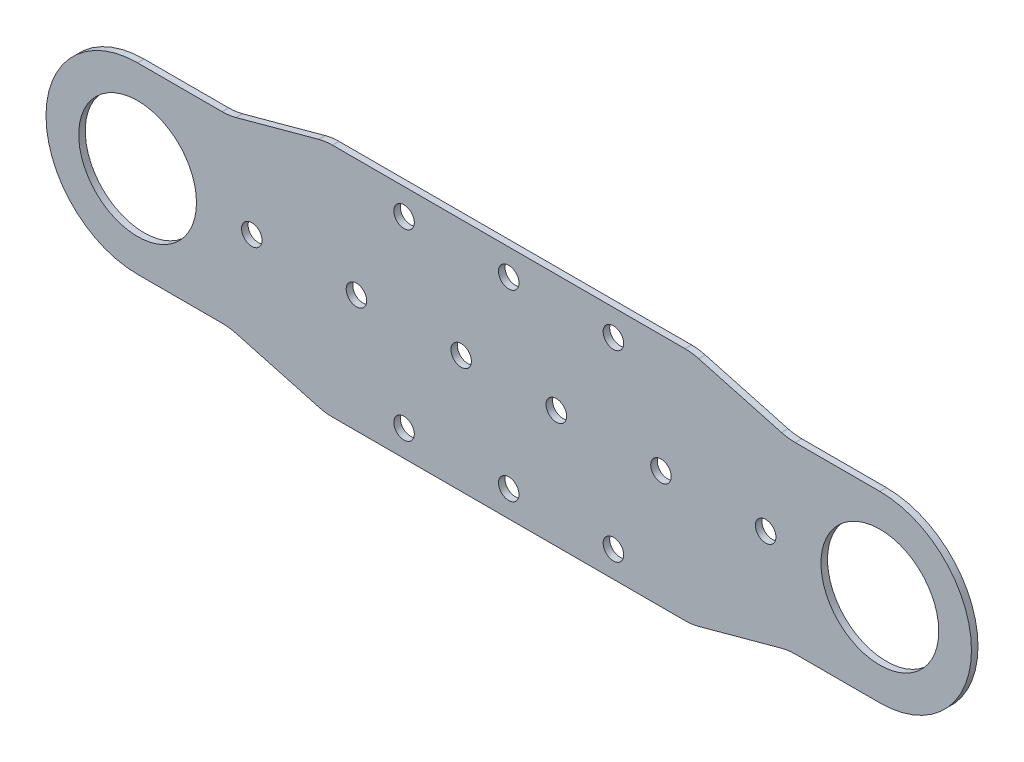
ISO-10303-21;
HEADER;
FILE_DESCRIPTION(('STEP AP214'),'2;1');
FILE_NAME('part.step','',(''),(''),'','','');
FILE_SCHEMA(('AUTOMOTIVE_DESIGN { 1 0 10303 214 1 1 1 1 }'));
ENDSEC;
DATA;
#1=APPLICATION_CONTEXT('core data for automotive mechanical design processes');
#2=APPLICATION_PROTOCOL_DEFINITION('international standard','automotive_design',2000,#1);
#3=PRODUCT_CONTEXT('',#1,'mechanical');
#4=PRODUCT('Part','Part','',(#3));
#5=PRODUCT_RELATED_PRODUCT_CATEGORY('part','',(#4));
#6=PRODUCT_DEFINITION_FORMATION('','',#4);
#7=PRODUCT_DEFINITION_CONTEXT('part definition',#1,'design');
#8=PRODUCT_DEFINITION('design','',#6,#7);
#9=PRODUCT_DEFINITION_SHAPE('','',#8);
#10=(LENGTH_UNIT() NAMED_UNIT(*) SI_UNIT(.MILLI.,.METRE.));
#11=(NAMED_UNIT(*) PLANE_ANGLE_UNIT() SI_UNIT($,.RADIAN.));
#12=(NAMED_UNIT(*) SI_UNIT($,.STERADIAN.) SOLID_ANGLE_UNIT());
#13=UNCERTAINTY_MEASURE_WITH_UNIT(LENGTH_MEASURE(1.E-05),#10,'distance_accuracy_value','');
#14=(GEOMETRIC_REPRESENTATION_CONTEXT(3) GLOBAL_UNCERTAINTY_ASSIGNED_CONTEXT((#13)) GLOBAL_UNIT_ASSIGNED_CONTEXT((#10,
#11,#12)) REPRESENTATION_CONTEXT('',''));
#15=CARTESIAN_POINT('',(0.,0.,0.));
#16=DIRECTION('',(0.,0.,1.));
#17=DIRECTION('',(1.,0.,0.));
#18=AXIS2_PLACEMENT_3D('',#15,#16,#17);
#19=CARTESIAN_POINT('',(0.,0.,1.5875));
#20=DIRECTION('',(0.,0.,1.));
#21=DIRECTION('',(1.,0.,0.));
#22=AXIS2_PLACEMENT_3D('',#19,#20,#21);
#23=PLANE('',#22);
#24=CARTESIAN_POINT('',(27.7114,0.,1.5875));
#25=DIRECTION('',(0.,0.,1.));
#26=DIRECTION('',(1.,0.,0.));
#27=AXIS2_PLACEMENT_3D('',#24,#25,#26);
#28=CIRCLE('',#27,2.48919999999999);
#29=CARTESIAN_POINT('',(30.2006,0.,1.5875));
#30=VERTEX_POINT('',#29);
#31=EDGE_CURVE('E456',#30,#30,#28,.T.);
#32=ORIENTED_EDGE('',*,*,#31,.F.);
#33=EDGE_LOOP('',(#32));
#34=FACE_BOUND('',#33,.T.);
#35=CARTESIAN_POINT('',(64.6557,22.225,1.5875));
#36=DIRECTION('',(0.,0.,1.));
#37=DIRECTION('',(1.,0.,0.));
#38=AXIS2_PLACEMENT_3D('',#35,#36,#37);
#39=CIRCLE('',#38,2.4892);
#40=CARTESIAN_POINT('',(67.1449,22.225,1.5875));
#41=VERTEX_POINT('',#40);
#42=EDGE_CURVE('E458',#41,#41,#39,.T.);
#43=ORIENTED_EDGE('',*,*,#42,.F.);
#44=EDGE_LOOP('',(#43));
#45=FACE_BOUND('',#44,.T.);
#46=CARTESIAN_POINT('',(90.0557,22.225,1.5875));
#47=DIRECTION('',(0.,0.,1.));
#48=DIRECTION('',(1.,0.,0.));
#49=AXIS2_PLACEMENT_3D('',#46,#47,#48);
#50=CIRCLE('',#49,2.4892);
#51=CARTESIAN_POINT('',(92.5449,22.225,1.5875));
#52=VERTEX_POINT('',#51);
#53=EDGE_CURVE('E466',#52,#52,#50,.T.);
#54=ORIENTED_EDGE('',*,*,#53,.F.);
#55=EDGE_LOOP('',(#54));
#56=FACE_BOUND('',#55,.T.);
#57=CARTESIAN_POINT('',(53.1114,0.,1.5875));
#58=DIRECTION('',(0.,0.,1.));
#59=DIRECTION('',(1.,0.,0.));
#60=AXIS2_PLACEMENT_3D('',#57,#58,#59);
#61=CIRCLE('',#60,2.48919999999999);
#62=CARTESIAN_POINT('',(55.6006,0.,1.5875));
#63=VERTEX_POINT('',#62);
#64=EDGE_CURVE('E472',#63,#63,#61,.T.);
#65=ORIENTED_EDGE('',*,*,#64,.F.);
#66=EDGE_LOOP('',(#65));
#67=FACE_BOUND('',#66,.T.);
#68=CARTESIAN_POINT('',(78.5114,0.,1.5875));
#69=DIRECTION('',(0.,0.,1.));
#70=DIRECTION('',(1.,0.,0.));
#71=AXIS2_PLACEMENT_3D('',#68,#69,#70);
#72=CIRCLE('',#71,2.4892);
#73=CARTESIAN_POINT('',(81.0006,0.,1.5875));
#74=VERTEX_POINT('',#73);
#75=EDGE_CURVE('E478',#74,#74,#72,.T.);
#76=ORIENTED_EDGE('',*,*,#75,.F.);
#77=EDGE_LOOP('',(#76));
#78=FACE_BOUND('',#77,.T.);
#79=CARTESIAN_POINT('',(101.6,0.,1.5875));
#80=DIRECTION('',(0.,0.,1.));
#81=DIRECTION('',(1.,0.,0.));
#82=AXIS2_PLACEMENT_3D('',#79,#80,#81);
#83=CIRCLE('',#82,2.4892);
#84=CARTESIAN_POINT('',(104.0892,0.,1.5875));
#85=VERTEX_POINT('',#84);
#86=EDGE_CURVE('E484',#85,#85,#83,.T.);
#87=ORIENTED_EDGE('',*,*,#86,.F.);
#88=EDGE_LOOP('',(#87));
#89=FACE_BOUND('',#88,.T.);
#90=CARTESIAN_POINT('',(127.,0.,1.5875));
#91=DIRECTION('',(0.,0.,1.));
#92=DIRECTION('',(1.,0.,0.));
#93=AXIS2_PLACEMENT_3D('',#90,#91,#92);
#94=CIRCLE('',#93,2.4892);
#95=CARTESIAN_POINT('',(129.4892,0.,1.5875));
#96=VERTEX_POINT('',#95);
#97=EDGE_CURVE('E490',#96,#96,#94,.T.);
#98=ORIENTED_EDGE('',*,*,#97,.F.);
#99=EDGE_LOOP('',(#98));
#100=FACE_BOUND('',#99,.T.);
#101=CARTESIAN_POINT('',(115.4557,22.225,1.5875));
#102=DIRECTION('',(0.,0.,1.));
#103=DIRECTION('',(1.,0.,0.));
#104=AXIS2_PLACEMENT_3D('',#101,#102,#103);
#105=CIRCLE('',#104,2.4892);
#106=CARTESIAN_POINT('',(117.9449,22.225,1.5875));
#107=VERTEX_POINT('',#106);
#108=EDGE_CURVE('E496',#107,#107,#105,.T.);
#109=ORIENTED_EDGE('',*,*,#108,.F.);
#110=EDGE_LOOP('',(#109));
#111=FACE_BOUND('',#110,.T.);
#112=CARTESIAN_POINT('',(152.4,0.,1.5875));
#113=DIRECTION('',(0.,0.,1.));
#114=DIRECTION('',(1.,0.,0.));
#115=AXIS2_PLACEMENT_3D('',#112,#113,#114);
#116=CIRCLE('',#115,2.4892);
#117=CARTESIAN_POINT('',(154.8892,0.,1.5875));
#118=VERTEX_POINT('',#117);
#119=EDGE_CURVE('E502',#118,#118,#116,.T.);
#120=ORIENTED_EDGE('',*,*,#119,.F.);
#121=EDGE_LOOP('',(#120));
#122=FACE_BOUND('',#121,.T.);
#123=CARTESIAN_POINT('',(115.4557,-22.225,1.5875));
#124=DIRECTION('',(0.,0.,1.));
#125=DIRECTION('',(1.,0.,0.));
#126=AXIS2_PLACEMENT_3D('',#123,#124,#125);
#127=CIRCLE('',#126,2.4892);
#128=CARTESIAN_POINT('',(117.9449,-22.225,1.5875));
#129=VERTEX_POINT('',#128);
#130=EDGE_CURVE('E508',#129,#129,#127,.T.);
#131=ORIENTED_EDGE('',*,*,#130,.F.);
#132=EDGE_LOOP('',(#131));
#133=FACE_BOUND('',#132,.T.);
#134=CARTESIAN_POINT('',(90.0556999999999,-22.225,1.5875));
#135=DIRECTION('',(0.,0.,1.));
#136=DIRECTION('',(1.,0.,0.));
#137=AXIS2_PLACEMENT_3D('',#134,#135,#136);
#138=CIRCLE('',#137,2.4892);
#139=CARTESIAN_POINT('',(92.5448999999999,-22.225,1.5875));
#140=VERTEX_POINT('',#139);
#141=EDGE_CURVE('E514',#140,#140,#138,.T.);
#142=ORIENTED_EDGE('',*,*,#141,.F.);
#143=EDGE_LOOP('',(#142));
#144=FACE_BOUND('',#143,.T.);
#145=CARTESIAN_POINT('',(64.6556999999999,-22.225,1.5875));
#146=DIRECTION('',(0.,0.,1.));
#147=DIRECTION('',(1.,0.,0.));
#148=AXIS2_PLACEMENT_3D('',#145,#146,#147);
#149=CIRCLE('',#148,2.4892);
#150=CARTESIAN_POINT('',(67.1448999999999,-22.225,1.5875));
#151=VERTEX_POINT('',#150);
#152=EDGE_CURVE('E520',#151,#151,#149,.T.);
#153=ORIENTED_EDGE('',*,*,#152,.F.);
#154=EDGE_LOOP('',(#153));
#155=FACE_BOUND('',#154,.T.);
#156=CARTESIAN_POINT('',(0.,0.,1.5875));
#157=DIRECTION('',(0.,0.,1.));
#158=DIRECTION('',(1.,0.,0.));
#159=AXIS2_PLACEMENT_3D('',#156,#157,#158);
#160=CIRCLE('',#159,14.2875);
#161=CARTESIAN_POINT('',(14.2875,0.,1.5875));
#162=VERTEX_POINT('',#161);
#163=EDGE_CURVE('E310',#162,#162,#160,.T.);
#164=ORIENTED_EDGE('',*,*,#163,.F.);
#165=EDGE_LOOP('',(#164));
#166=FACE_BOUND('',#165,.T.);
#167=DIRECTION('',(-0.965041508014612,0.262097096147369,0.));
#168=VECTOR('',#167,1.);
#169=CARTESIAN_POINT('',(134.5057,28.575,1.5875));
#170=LINE('',#169,#168);
#171=CARTESIAN_POINT('',(156.251691972874,22.6689728482144,1.5875));
#172=VERTEX_POINT('',#171);
#173=CARTESIAN_POINT('',(136.140408027125,28.1310271517856,1.5875));
#174=VERTEX_POINT('',#173);
#175=EDGE_CURVE('E300',#172,#174,#170,.T.);
#176=ORIENTED_EDGE('',*,*,#175,.T.);
#177=CARTESIAN_POINT('',(132.811774906054,15.875,1.5875));
#178=DIRECTION('',(0.,0.,1.));
#179=DIRECTION('',(1.,0.,0.));
#180=AXIS2_PLACEMENT_3D('',#177,#178,#179);
#181=CIRCLE('',#180,12.7);
#182=CARTESIAN_POINT('',(132.811774906054,28.575,1.5875));
#183=VERTEX_POINT('',#182);
#184=EDGE_CURVE('E237',#174,#183,#181,.T.);
#185=ORIENTED_EDGE('',*,*,#184,.T.);
#186=DIRECTION('',(-1.,0.,0.));
#187=VECTOR('',#186,1.);
#188=CARTESIAN_POINT('',(45.6057,28.575,1.5875));
#189=LINE('',#188,#187);
#190=CARTESIAN_POINT('',(47.2996250939461,28.575,1.5875));
#191=VERTEX_POINT('',#190);
#192=EDGE_CURVE('E302',#183,#191,#189,.T.);
#193=ORIENTED_EDGE('',*,*,#192,.T.);
#194=CARTESIAN_POINT('',(47.2996250939461,15.875,1.5875));
#195=DIRECTION('',(0.,0.,1.));
#196=DIRECTION('',(1.,0.,0.));
#197=AXIS2_PLACEMENT_3D('',#194,#195,#196);
#198=CIRCLE('',#197,12.7);
#199=CARTESIAN_POINT('',(43.9709919728745,28.1310271517856,1.5875));
#200=VERTEX_POINT('',#199);
#201=EDGE_CURVE('E231',#191,#200,#198,.T.);
#202=ORIENTED_EDGE('',*,*,#201,.T.);
#203=DIRECTION('',(-0.965041508014612,-0.262097096147369,0.));
#204=VECTOR('',#203,1.);
#205=CARTESIAN_POINT('',(22.225,22.225,1.5875));
#206=LINE('',#205,#204);
#207=CARTESIAN_POINT('',(23.8597080271255,22.6689728482144,1.5875));
#208=VERTEX_POINT('',#207);
#209=EDGE_CURVE('E305',#200,#208,#206,.T.);
#210=ORIENTED_EDGE('',*,*,#209,.T.);
#211=CARTESIAN_POINT('',(20.5310749060539,34.925,1.5875));
#212=DIRECTION('',(0.,0.,1.));
#213=DIRECTION('',(1.,0.,0.));
#214=AXIS2_PLACEMENT_3D('',#211,#212,#213);
#215=CIRCLE('',#214,12.7);
#216=CARTESIAN_POINT('',(20.5310749060539,22.225,1.5875));
#217=VERTEX_POINT('',#216);
#218=EDGE_CURVE('E261',#208,#217,#215,.F.);
#219=ORIENTED_EDGE('',*,*,#218,.T.);
#220=DIRECTION('',(-1.,0.,0.));
#221=VECTOR('',#220,1.);
#222=CARTESIAN_POINT('',(0.,22.225,1.5875));
#223=LINE('',#222,#221);
#224=CARTESIAN_POINT('',(0.,22.225,1.5875));
#225=VERTEX_POINT('',#224);
#226=EDGE_CURVE('E189',#217,#225,#223,.T.);
#227=ORIENTED_EDGE('',*,*,#226,.T.);
#228=CARTESIAN_POINT('',(0.,0.,1.5875));
#229=DIRECTION('',(0.,0.,1.));
#230=DIRECTION('',(1.,0.,0.));
#231=AXIS2_PLACEMENT_3D('',#228,#229,#230);
#232=CIRCLE('',#231,22.225);
#233=CARTESIAN_POINT('',(0.,-22.225,1.5875));
#234=VERTEX_POINT('',#233);
#235=EDGE_CURVE('E183',#225,#234,#232,.T.);
#236=ORIENTED_EDGE('',*,*,#235,.T.);
#237=DIRECTION('',(1.,0.,0.));
#238=VECTOR('',#237,1.);
#239=CARTESIAN_POINT('',(0.,-22.225,1.5875));
#240=LINE('',#239,#238);
#241=CARTESIAN_POINT('',(20.5310749060539,-22.225,1.5875));
#242=VERTEX_POINT('',#241);
#243=EDGE_CURVE('E172',#234,#242,#240,.T.);
#244=ORIENTED_EDGE('',*,*,#243,.T.);
#245=CARTESIAN_POINT('',(20.5310749060539,-34.925,1.5875));
#246=DIRECTION('',(0.,0.,1.));
#247=DIRECTION('',(1.,0.,0.));
#248=AXIS2_PLACEMENT_3D('',#245,#246,#247);
#249=CIRCLE('',#248,12.7);
#250=CARTESIAN_POINT('',(23.8597080271255,-22.6689728482144,1.5875));
#251=VERTEX_POINT('',#250);
#252=EDGE_CURVE('E11',#242,#251,#249,.F.);
#253=ORIENTED_EDGE('',*,*,#252,.T.);
#254=DIRECTION('',(0.965041508014612,-0.262097096147369,0.));
#255=VECTOR('',#254,1.);
#256=CARTESIAN_POINT('',(22.225,-22.225,1.5875));
#257=LINE('',#256,#255);
#258=CARTESIAN_POINT('',(43.9709919728745,-28.1310271517856,1.5875));
#259=VERTEX_POINT('',#258);
#260=EDGE_CURVE('E182',#251,#259,#257,.T.);
#261=ORIENTED_EDGE('',*,*,#260,.T.);
#262=CARTESIAN_POINT('',(47.2996250939461,-15.875,1.5875));
#263=DIRECTION('',(0.,0.,1.));
#264=DIRECTION('',(1.,0.,0.));
#265=AXIS2_PLACEMENT_3D('',#262,#263,#264);
#266=CIRCLE('',#265,12.7);
#267=CARTESIAN_POINT('',(47.2996250939461,-28.575,1.5875));
#268=VERTEX_POINT('',#267);
#269=EDGE_CURVE('E233',#259,#268,#266,.T.);
#270=ORIENTED_EDGE('',*,*,#269,.T.);
#271=DIRECTION('',(1.,0.,0.));
#272=VECTOR('',#271,1.);
#273=CARTESIAN_POINT('',(45.6057,-28.575,1.5875));
#274=LINE('',#273,#272);
#275=CARTESIAN_POINT('',(132.811774906054,-28.575,1.5875));
#276=VERTEX_POINT('',#275);
#277=EDGE_CURVE('E287',#268,#276,#274,.T.);
#278=ORIENTED_EDGE('',*,*,#277,.T.);
#279=CARTESIAN_POINT('',(132.811774906054,-15.875,1.5875));
#280=DIRECTION('',(0.,0.,1.));
#281=DIRECTION('',(1.,0.,0.));
#282=AXIS2_PLACEMENT_3D('',#279,#280,#281);
#283=CIRCLE('',#282,12.7);
#284=CARTESIAN_POINT('',(136.140408027125,-28.1310271517856,1.5875));
#285=VERTEX_POINT('',#284);
#286=EDGE_CURVE('E235',#276,#285,#283,.T.);
#287=ORIENTED_EDGE('',*,*,#286,.T.);
#288=DIRECTION('',(0.965041508014612,0.262097096147369,0.));
#289=VECTOR('',#288,1.);
#290=CARTESIAN_POINT('',(134.5057,-28.575,1.5875));
#291=LINE('',#290,#289);
#292=CARTESIAN_POINT('',(156.251691972874,-22.6689728482144,1.5875));
#293=VERTEX_POINT('',#292);
#294=EDGE_CURVE('E290',#285,#293,#291,.T.);
#295=ORIENTED_EDGE('',*,*,#294,.T.);
#296=CARTESIAN_POINT('',(159.580325093946,-34.925,1.5875));
#297=DIRECTION('',(0.,0.,1.));
#298=DIRECTION('',(1.,0.,0.));
#299=AXIS2_PLACEMENT_3D('',#296,#297,#298);
#300=CIRCLE('',#299,12.7);
#301=CARTESIAN_POINT('',(159.580325093946,-22.225,1.5875));
#302=VERTEX_POINT('',#301);
#303=EDGE_CURVE('E56',#293,#302,#300,.F.);
#304=ORIENTED_EDGE('',*,*,#303,.T.);
#305=DIRECTION('',(1.,0.,0.));
#306=VECTOR('',#305,1.);
#307=CARTESIAN_POINT('',(157.8864,-22.225,1.5875));
#308=LINE('',#307,#306);
#309=CARTESIAN_POINT('',(180.1114,-22.225,1.5875));
#310=VERTEX_POINT('',#309);
#311=EDGE_CURVE('E294',#302,#310,#308,.T.);
#312=ORIENTED_EDGE('',*,*,#311,.T.);
#313=CARTESIAN_POINT('',(180.1114,0.,1.5875));
#314=DIRECTION('',(0.,0.,1.));
#315=DIRECTION('',(-1.,0.,0.));
#316=AXIS2_PLACEMENT_3D('',#313,#314,#315);
#317=CIRCLE('',#316,22.225);
#318=CARTESIAN_POINT('',(180.1114,22.225,1.5875));
#319=VERTEX_POINT('',#318);
#320=EDGE_CURVE('E296',#310,#319,#317,.T.);
#321=ORIENTED_EDGE('',*,*,#320,.T.);
#322=DIRECTION('',(-1.,0.,0.));
#323=VECTOR('',#322,1.);
#324=CARTESIAN_POINT('',(157.8864,22.225,1.5875));
#325=LINE('',#324,#323);
#326=CARTESIAN_POINT('',(159.580325093946,22.225,1.5875));
#327=VERTEX_POINT('',#326);
#328=EDGE_CURVE('E298',#319,#327,#325,.T.);
#329=ORIENTED_EDGE('',*,*,#328,.T.);
#330=CARTESIAN_POINT('',(159.580325093946,34.925,1.5875));
#331=DIRECTION('',(0.,0.,1.));
#332=DIRECTION('',(1.,0.,0.));
#333=AXIS2_PLACEMENT_3D('',#330,#331,#332);
#334=CIRCLE('',#333,12.7);
#335=EDGE_CURVE('E265',#327,#172,#334,.F.);
#336=ORIENTED_EDGE('',*,*,#335,.T.);
#337=EDGE_LOOP('',(#176,#185,#193,#202,#210,#219,#227,#236,#244,#253,#261,#270,#278,#287,#295,
#304,#312,#321,#329,#336));
#338=FACE_BOUND('',#337,.T.);
#339=CARTESIAN_POINT('',(180.1114,0.,1.5875));
#340=DIRECTION('',(0.,0.,1.));
#341=DIRECTION('',(1.,0.,0.));
#342=AXIS2_PLACEMENT_3D('',#339,#340,#341);
#343=CIRCLE('',#342,14.2875);
#344=CARTESIAN_POINT('',(194.3989,0.,1.5875));
#345=VERTEX_POINT('',#344);
#346=EDGE_CURVE('E527',#345,#345,#343,.T.);
#347=ORIENTED_EDGE('',*,*,#346,.F.);
#348=EDGE_LOOP('',(#347));
#349=FACE_BOUND('',#348,.T.);
#350=ADVANCED_FACE('F33',(#34,#45,#56,#67,#78,#89,#100,#111,#122,#133,#144,#155,#166,#338,#349),
#23,.T.);
#351=CARTESIAN_POINT('',(0.,0.,0.));
#352=DIRECTION('',(0.,0.,1.));
#353=DIRECTION('',(1.,0.,0.));
#354=AXIS2_PLACEMENT_3D('',#351,#352,#353);
#355=PLANE('',#354);
#356=CARTESIAN_POINT('',(27.7114,0.,0.));
#357=DIRECTION('',(0.,0.,1.));
#358=DIRECTION('',(1.,0.,0.));
#359=AXIS2_PLACEMENT_3D('',#356,#357,#358);
#360=CIRCLE('',#359,2.48919999999999);
#361=CARTESIAN_POINT('',(30.2006,0.,0.));
#362=VERTEX_POINT('',#361);
#363=EDGE_CURVE('E454',#362,#362,#360,.T.);
#364=ORIENTED_EDGE('',*,*,#363,.T.);
#365=EDGE_LOOP('',(#364));
#366=FACE_BOUND('',#365,.T.);
#367=CARTESIAN_POINT('',(64.6557,22.225,0.));
#368=DIRECTION('',(0.,0.,1.));
#369=DIRECTION('',(1.,0.,0.));
#370=AXIS2_PLACEMENT_3D('',#367,#368,#369);
#371=CIRCLE('',#370,2.4892);
#372=CARTESIAN_POINT('',(67.1449,22.225,0.));
#373=VERTEX_POINT('',#372);
#374=EDGE_CURVE('E463',#373,#373,#371,.T.);
#375=ORIENTED_EDGE('',*,*,#374,.T.);
#376=EDGE_LOOP('',(#375));
#377=FACE_BOUND('',#376,.T.);
#378=CARTESIAN_POINT('',(90.0557,22.225,0.));
#379=DIRECTION('',(0.,0.,1.));
#380=DIRECTION('',(1.,0.,0.));
#381=AXIS2_PLACEMENT_3D('',#378,#379,#380);
#382=CIRCLE('',#381,2.4892);
#383=CARTESIAN_POINT('',(92.5449,22.225,0.));
#384=VERTEX_POINT('',#383);
#385=EDGE_CURVE('E469',#384,#384,#382,.T.);
#386=ORIENTED_EDGE('',*,*,#385,.T.);
#387=EDGE_LOOP('',(#386));
#388=FACE_BOUND('',#387,.T.);
#389=CARTESIAN_POINT('',(53.1114,0.,0.));
#390=DIRECTION('',(0.,0.,1.));
#391=DIRECTION('',(1.,0.,0.));
#392=AXIS2_PLACEMENT_3D('',#389,#390,#391);
#393=CIRCLE('',#392,2.48919999999999);
#394=CARTESIAN_POINT('',(55.6006,0.,0.));
#395=VERTEX_POINT('',#394);
#396=EDGE_CURVE('E475',#395,#395,#393,.T.);
#397=ORIENTED_EDGE('',*,*,#396,.T.);
#398=EDGE_LOOP('',(#397));
#399=FACE_BOUND('',#398,.T.);
#400=CARTESIAN_POINT('',(78.5114,0.,0.));
#401=DIRECTION('',(0.,0.,1.));
#402=DIRECTION('',(1.,0.,0.));
#403=AXIS2_PLACEMENT_3D('',#400,#401,#402);
#404=CIRCLE('',#403,2.4892);
#405=CARTESIAN_POINT('',(81.0006,0.,0.));
#406=VERTEX_POINT('',#405);
#407=EDGE_CURVE('E481',#406,#406,#404,.T.);
#408=ORIENTED_EDGE('',*,*,#407,.T.);
#409=EDGE_LOOP('',(#408));
#410=FACE_BOUND('',#409,.T.);
#411=CARTESIAN_POINT('',(101.6,0.,0.));
#412=DIRECTION('',(0.,0.,1.));
#413=DIRECTION('',(1.,0.,0.));
#414=AXIS2_PLACEMENT_3D('',#411,#412,#413);
#415=CIRCLE('',#414,2.4892);
#416=CARTESIAN_POINT('',(104.0892,0.,0.));
#417=VERTEX_POINT('',#416);
#418=EDGE_CURVE('E487',#417,#417,#415,.T.);
#419=ORIENTED_EDGE('',*,*,#418,.T.);
#420=EDGE_LOOP('',(#419));
#421=FACE_BOUND('',#420,.T.);
#422=CARTESIAN_POINT('',(127.,0.,0.));
#423=DIRECTION('',(0.,0.,1.));
#424=DIRECTION('',(1.,0.,0.));
#425=AXIS2_PLACEMENT_3D('',#422,#423,#424);
#426=CIRCLE('',#425,2.4892);
#427=CARTESIAN_POINT('',(129.4892,0.,0.));
#428=VERTEX_POINT('',#427);
#429=EDGE_CURVE('E493',#428,#428,#426,.T.);
#430=ORIENTED_EDGE('',*,*,#429,.T.);
#431=EDGE_LOOP('',(#430));
#432=FACE_BOUND('',#431,.T.);
#433=CARTESIAN_POINT('',(115.4557,22.225,0.));
#434=DIRECTION('',(0.,0.,1.));
#435=DIRECTION('',(1.,0.,0.));
#436=AXIS2_PLACEMENT_3D('',#433,#434,#435);
#437=CIRCLE('',#436,2.4892);
#438=CARTESIAN_POINT('',(117.9449,22.225,0.));
#439=VERTEX_POINT('',#438);
#440=EDGE_CURVE('E499',#439,#439,#437,.T.);
#441=ORIENTED_EDGE('',*,*,#440,.T.);
#442=EDGE_LOOP('',(#441));
#443=FACE_BOUND('',#442,.T.);
#444=CARTESIAN_POINT('',(152.4,0.,0.));
#445=DIRECTION('',(0.,0.,1.));
#446=DIRECTION('',(1.,0.,0.));
#447=AXIS2_PLACEMENT_3D('',#444,#445,#446);
#448=CIRCLE('',#447,2.4892);
#449=CARTESIAN_POINT('',(154.8892,0.,0.));
#450=VERTEX_POINT('',#449);
#451=EDGE_CURVE('E505',#450,#450,#448,.T.);
#452=ORIENTED_EDGE('',*,*,#451,.T.);
#453=EDGE_LOOP('',(#452));
#454=FACE_BOUND('',#453,.T.);
#455=CARTESIAN_POINT('',(115.4557,-22.225,0.));
#456=DIRECTION('',(0.,0.,1.));
#457=DIRECTION('',(1.,0.,0.));
#458=AXIS2_PLACEMENT_3D('',#455,#456,#457);
#459=CIRCLE('',#458,2.4892);
#460=CARTESIAN_POINT('',(117.9449,-22.225,0.));
#461=VERTEX_POINT('',#460);
#462=EDGE_CURVE('E511',#461,#461,#459,.T.);
#463=ORIENTED_EDGE('',*,*,#462,.T.);
#464=EDGE_LOOP('',(#463));
#465=FACE_BOUND('',#464,.T.);
#466=CARTESIAN_POINT('',(90.0556999999999,-22.225,0.));
#467=DIRECTION('',(0.,0.,1.));
#468=DIRECTION('',(1.,0.,0.));
#469=AXIS2_PLACEMENT_3D('',#466,#467,#468);
#470=CIRCLE('',#469,2.4892);
#471=CARTESIAN_POINT('',(92.5448999999999,-22.225,0.));
#472=VERTEX_POINT('',#471);
#473=EDGE_CURVE('E517',#472,#472,#470,.T.);
#474=ORIENTED_EDGE('',*,*,#473,.T.);
#475=EDGE_LOOP('',(#474));
#476=FACE_BOUND('',#475,.T.);
#477=CARTESIAN_POINT('',(64.6556999999999,-22.225,0.));
#478=DIRECTION('',(0.,0.,1.));
#479=DIRECTION('',(1.,0.,0.));
#480=AXIS2_PLACEMENT_3D('',#477,#478,#479);
#481=CIRCLE('',#480,2.4892);
#482=CARTESIAN_POINT('',(67.1448999999999,-22.225,0.));
#483=VERTEX_POINT('',#482);
#484=EDGE_CURVE('E523',#483,#483,#481,.T.);
#485=ORIENTED_EDGE('',*,*,#484,.T.);
#486=EDGE_LOOP('',(#485));
#487=FACE_BOUND('',#486,.T.);
#488=DIRECTION('',(-1.,0.,0.));
#489=VECTOR('',#488,1.);
#490=CARTESIAN_POINT('',(45.6057,28.575,0.));
#491=LINE('',#490,#489);
#492=CARTESIAN_POINT('',(132.811774906054,28.575,0.));
#493=VERTEX_POINT('',#492);
#494=CARTESIAN_POINT('',(47.2996250939461,28.575,0.));
#495=VERTEX_POINT('',#494);
#496=EDGE_CURVE('E328',#493,#495,#491,.T.);
#497=ORIENTED_EDGE('',*,*,#496,.F.);
#498=CARTESIAN_POINT('',(132.811774906054,15.875,0.));
#499=DIRECTION('',(0.,0.,1.));
#500=DIRECTION('',(1.,0.,0.));
#501=AXIS2_PLACEMENT_3D('',#498,#499,#500);
#502=CIRCLE('',#501,12.7);
#503=CARTESIAN_POINT('',(136.140408027125,28.1310271517856,0.));
#504=VERTEX_POINT('',#503);
#505=EDGE_CURVE('E224',#493,#504,#502,.F.);
#506=ORIENTED_EDGE('',*,*,#505,.T.);
#507=DIRECTION('',(-0.965041508014612,0.262097096147369,0.));
#508=VECTOR('',#507,1.);
#509=CARTESIAN_POINT('',(134.5057,28.575,0.));
#510=LINE('',#509,#508);
#511=CARTESIAN_POINT('',(156.251691972874,22.6689728482144,0.));
#512=VERTEX_POINT('',#511);
#513=EDGE_CURVE('E325',#512,#504,#510,.T.);
#514=ORIENTED_EDGE('',*,*,#513,.F.);
#515=CARTESIAN_POINT('',(159.580325093946,34.925,0.));
#516=DIRECTION('',(0.,0.,1.));
#517=DIRECTION('',(1.,0.,0.));
#518=AXIS2_PLACEMENT_3D('',#515,#516,#517);
#519=CIRCLE('',#518,12.7);
#520=CARTESIAN_POINT('',(159.580325093946,22.225,0.));
#521=VERTEX_POINT('',#520);
#522=EDGE_CURVE('E263',#512,#521,#519,.T.);
#523=ORIENTED_EDGE('',*,*,#522,.T.);
#524=DIRECTION('',(-1.,0.,0.));
#525=VECTOR('',#524,1.);
#526=CARTESIAN_POINT('',(157.8864,22.225,0.));
#527=LINE('',#526,#525);
#528=CARTESIAN_POINT('',(180.1114,22.225,0.));
#529=VERTEX_POINT('',#528);
#530=EDGE_CURVE('E323',#529,#521,#527,.T.);
#531=ORIENTED_EDGE('',*,*,#530,.F.);
#532=CARTESIAN_POINT('',(180.1114,0.,0.));
#533=DIRECTION('',(0.,0.,1.));
#534=DIRECTION('',(-1.,0.,0.));
#535=AXIS2_PLACEMENT_3D('',#532,#533,#534);
#536=CIRCLE('',#535,22.225);
#537=CARTESIAN_POINT('',(180.1114,-22.225,0.));
#538=VERTEX_POINT('',#537);
#539=EDGE_CURVE('E321',#538,#529,#536,.T.);
#540=ORIENTED_EDGE('',*,*,#539,.F.);
#541=DIRECTION('',(1.,0.,0.));
#542=VECTOR('',#541,1.);
#543=CARTESIAN_POINT('',(157.8864,-22.225,0.));
#544=LINE('',#543,#542);
#545=CARTESIAN_POINT('',(159.580325093946,-22.225,0.));
#546=VERTEX_POINT('',#545);
#547=EDGE_CURVE('E319',#546,#538,#544,.T.);
#548=ORIENTED_EDGE('',*,*,#547,.F.);
#549=CARTESIAN_POINT('',(159.580325093946,-34.925,0.));
#550=DIRECTION('',(0.,0.,1.));
#551=DIRECTION('',(1.,0.,0.));
#552=AXIS2_PLACEMENT_3D('',#549,#550,#551);
#553=CIRCLE('',#552,12.7);
#554=CARTESIAN_POINT('',(156.251691972874,-22.6689728482144,0.));
#555=VERTEX_POINT('',#554);
#556=EDGE_CURVE('E267',#546,#555,#553,.T.);
#557=ORIENTED_EDGE('',*,*,#556,.T.);
#558=DIRECTION('',(0.965041508014612,0.262097096147369,0.));
#559=VECTOR('',#558,1.);
#560=CARTESIAN_POINT('',(134.5057,-28.575,0.));
#561=LINE('',#560,#559);
#562=CARTESIAN_POINT('',(136.140408027125,-28.1310271517856,0.));
#563=VERTEX_POINT('',#562);
#564=EDGE_CURVE('E316',#563,#555,#561,.T.);
#565=ORIENTED_EDGE('',*,*,#564,.F.);
#566=CARTESIAN_POINT('',(132.811774906054,-15.875,0.));
#567=DIRECTION('',(0.,0.,1.));
#568=DIRECTION('',(1.,0.,0.));
#569=AXIS2_PLACEMENT_3D('',#566,#567,#568);
#570=CIRCLE('',#569,12.7);
#571=CARTESIAN_POINT('',(132.811774906054,-28.575,0.));
#572=VERTEX_POINT('',#571);
#573=EDGE_CURVE('E222',#563,#572,#570,.F.);
#574=ORIENTED_EDGE('',*,*,#573,.T.);
#575=DIRECTION('',(1.,0.,0.));
#576=VECTOR('',#575,1.);
#577=CARTESIAN_POINT('',(45.6057,-28.575,0.));
#578=LINE('',#577,#576);
#579=CARTESIAN_POINT('',(47.2996250939461,-28.575,0.));
#580=VERTEX_POINT('',#579);
#581=EDGE_CURVE('E313',#580,#572,#578,.T.);
#582=ORIENTED_EDGE('',*,*,#581,.F.);
#583=CARTESIAN_POINT('',(47.2996250939461,-15.875,0.));
#584=DIRECTION('',(0.,0.,1.));
#585=DIRECTION('',(1.,0.,0.));
#586=AXIS2_PLACEMENT_3D('',#583,#584,#585);
#587=CIRCLE('',#586,12.7);
#588=CARTESIAN_POINT('',(43.9709919728745,-28.1310271517856,0.));
#589=VERTEX_POINT('',#588);
#590=EDGE_CURVE('E220',#580,#589,#587,.F.);
#591=ORIENTED_EDGE('',*,*,#590,.T.);
#592=DIRECTION('',(0.965041508014612,-0.262097096147369,0.));
#593=VECTOR('',#592,1.);
#594=CARTESIAN_POINT('',(22.225,-22.225,0.));
#595=LINE('',#594,#593);
#596=CARTESIAN_POINT('',(23.8597080271255,-22.6689728482144,0.));
#597=VERTEX_POINT('',#596);
#598=EDGE_CURVE('E276',#597,#589,#595,.T.);
#599=ORIENTED_EDGE('',*,*,#598,.F.);
#600=CARTESIAN_POINT('',(20.5310749060539,-34.925,0.));
#601=DIRECTION('',(0.,0.,1.));
#602=DIRECTION('',(1.,0.,0.));
#603=AXIS2_PLACEMENT_3D('',#600,#601,#602);
#604=CIRCLE('',#603,12.7);
#605=CARTESIAN_POINT('',(20.5310749060539,-22.225,0.));
#606=VERTEX_POINT('',#605);
#607=EDGE_CURVE('E41',#597,#606,#604,.T.);
#608=ORIENTED_EDGE('',*,*,#607,.T.);
#609=DIRECTION('',(1.,0.,0.));
#610=VECTOR('',#609,1.);
#611=CARTESIAN_POINT('',(0.,-22.225,0.));
#612=LINE('',#611,#610);
#613=CARTESIAN_POINT('',(0.,-22.225,0.));
#614=VERTEX_POINT('',#613);
#615=EDGE_CURVE('E274',#614,#606,#612,.T.);
#616=ORIENTED_EDGE('',*,*,#615,.F.);
#617=CARTESIAN_POINT('',(0.,0.,0.));
#618=DIRECTION('',(0.,0.,1.));
#619=DIRECTION('',(1.,0.,0.));
#620=AXIS2_PLACEMENT_3D('',#617,#618,#619);
#621=CIRCLE('',#620,22.225);
#622=CARTESIAN_POINT('',(0.,22.225,0.));
#623=VERTEX_POINT('',#622);
#624=EDGE_CURVE('E197',#623,#614,#621,.T.);
#625=ORIENTED_EDGE('',*,*,#624,.F.);
#626=DIRECTION('',(-1.,0.,0.));
#627=VECTOR('',#626,1.);
#628=CARTESIAN_POINT('',(0.,22.225,0.));
#629=LINE('',#628,#627);
#630=CARTESIAN_POINT('',(20.5310749060539,22.225,0.));
#631=VERTEX_POINT('',#630);
#632=EDGE_CURVE('E193',#631,#623,#629,.T.);
#633=ORIENTED_EDGE('',*,*,#632,.F.);
#634=CARTESIAN_POINT('',(20.5310749060539,34.925,0.));
#635=DIRECTION('',(0.,0.,1.));
#636=DIRECTION('',(1.,0.,0.));
#637=AXIS2_PLACEMENT_3D('',#634,#635,#636);
#638=CIRCLE('',#637,12.7);
#639=CARTESIAN_POINT('',(23.8597080271255,22.6689728482144,0.));
#640=VERTEX_POINT('',#639);
#641=EDGE_CURVE('E259',#631,#640,#638,.T.);
#642=ORIENTED_EDGE('',*,*,#641,.T.);
#643=DIRECTION('',(-0.965041508014612,-0.262097096147369,0.));
#644=VECTOR('',#643,1.);
#645=CARTESIAN_POINT('',(22.225,22.225,0.));
#646=LINE('',#645,#644);
#647=CARTESIAN_POINT('',(43.9709919728745,28.1310271517856,0.));
#648=VERTEX_POINT('',#647);
#649=EDGE_CURVE('E331',#648,#640,#646,.T.);
#650=ORIENTED_EDGE('',*,*,#649,.F.);
#651=CARTESIAN_POINT('',(47.2996250939461,15.875,0.));
#652=DIRECTION('',(0.,0.,1.));
#653=DIRECTION('',(1.,0.,0.));
#654=AXIS2_PLACEMENT_3D('',#651,#652,#653);
#655=CIRCLE('',#654,12.7);
#656=EDGE_CURVE('E218',#648,#495,#655,.F.);
#657=ORIENTED_EDGE('',*,*,#656,.T.);
#658=EDGE_LOOP('',(#497,#506,#514,#523,#531,#540,#548,#557,#565,#574,#582,#591,#599,#608,#616,
#625,#633,#642,#650,#657));
#659=FACE_BOUND('',#658,.T.);
#660=CARTESIAN_POINT('',(0.,0.,0.));
#661=DIRECTION('',(0.,0.,1.));
#662=DIRECTION('',(1.,0.,0.));
#663=AXIS2_PLACEMENT_3D('',#660,#661,#662);
#664=CIRCLE('',#663,14.2875);
#665=CARTESIAN_POINT('',(14.2875,0.,0.));
#666=VERTEX_POINT('',#665);
#667=EDGE_CURVE('E530',#666,#666,#664,.T.);
#668=ORIENTED_EDGE('',*,*,#667,.T.);
#669=EDGE_LOOP('',(#668));
#670=FACE_BOUND('',#669,.T.);
#671=CARTESIAN_POINT('',(180.1114,0.,0.));
#672=DIRECTION('',(0.,0.,1.));
#673=DIRECTION('',(1.,0.,0.));
#674=AXIS2_PLACEMENT_3D('',#671,#672,#673);
#675=CIRCLE('',#674,14.2875);
#676=CARTESIAN_POINT('',(194.3989,0.,0.));
#677=VERTEX_POINT('',#676);
#678=EDGE_CURVE('E526',#677,#677,#675,.T.);
#679=ORIENTED_EDGE('',*,*,#678,.T.);
#680=EDGE_LOOP('',(#679));
#681=FACE_BOUND('',#680,.T.);
#682=ADVANCED_FACE('F272',(#366,#377,#388,#399,#410,#421,#432,#443,#454,#465,#476,#487,#659,
#670,#681),#355,.F.);
#683=CARTESIAN_POINT('',(0.,0.,1.5875));
#684=DIRECTION('',(0.,0.,-1.));
#685=DIRECTION('',(-1.,0.,0.));
#686=AXIS2_PLACEMENT_3D('',#683,#684,#685);
#687=CYLINDRICAL_SURFACE('',#686,22.225);
#688=ORIENTED_EDGE('',*,*,#624,.T.);
#689=DIRECTION('',(0.,0.,-1.));
#690=VECTOR('',#689,1.);
#691=CARTESIAN_POINT('',(0.,-22.225,1.5875));
#692=LINE('',#691,#690);
#693=EDGE_CURVE('E177',#234,#614,#692,.T.);
#694=ORIENTED_EDGE('',*,*,#693,.F.);
#695=ORIENTED_EDGE('',*,*,#235,.F.);
#696=DIRECTION('',(0.,0.,-1.));
#697=VECTOR('',#696,1.);
#698=CARTESIAN_POINT('',(0.,22.225,1.5875));
#699=LINE('',#698,#697);
#700=EDGE_CURVE('E309',#225,#623,#699,.T.);
#701=ORIENTED_EDGE('',*,*,#700,.T.);
#702=EDGE_LOOP('',(#688,#694,#695,#701));
#703=FACE_BOUND('',#702,.T.);
#704=ADVANCED_FACE('F195',(#703),#687,.T.);
#705=CARTESIAN_POINT('',(0.,-22.225,1.5875));
#706=DIRECTION('',(0.,1.,0.));
#707=DIRECTION('',(0.,0.,1.));
#708=AXIS2_PLACEMENT_3D('',#705,#706,#707);
#709=PLANE('',#708);
#710=ORIENTED_EDGE('',*,*,#615,.T.);
#711=DIRECTION('',(0.,0.,-1.));
#712=VECTOR('',#711,1.);
#713=CARTESIAN_POINT('',(20.5310749060539,-22.225,1.5875));
#714=LINE('',#713,#712);
#715=EDGE_CURVE('E180',#606,#242,#714,.F.);
#716=ORIENTED_EDGE('',*,*,#715,.T.);
#717=ORIENTED_EDGE('',*,*,#243,.F.);
#718=ORIENTED_EDGE('',*,*,#693,.T.);
#719=EDGE_LOOP('',(#710,#716,#717,#718));
#720=FACE_BOUND('',#719,.T.);
#721=ADVANCED_FACE('F175',(#720),#709,.F.);
#722=CARTESIAN_POINT('',(22.225,-22.225,1.5875));
#723=DIRECTION('',(0.262097096147369,0.965041508014612,0.));
#724=DIRECTION('',(-0.965041508014612,0.262097096147369,0.));
#725=AXIS2_PLACEMENT_3D('',#722,#723,#724);
#726=PLANE('',#725);
#727=ORIENTED_EDGE('',*,*,#598,.T.);
#728=DIRECTION('',(0.,0.,-1.));
#729=VECTOR('',#728,1.);
#730=CARTESIAN_POINT('',(43.9709919728745,-28.1310271517856,1.5875));
#731=LINE('',#730,#729);
#732=EDGE_CURVE('E256',#589,#259,#731,.F.);
#733=ORIENTED_EDGE('',*,*,#732,.T.);
#734=ORIENTED_EDGE('',*,*,#260,.F.);
#735=DIRECTION('',(0.,0.,-1.));
#736=VECTOR('',#735,1.);
#737=CARTESIAN_POINT('',(23.8597080271255,-22.6689728482144,0.));
#738=LINE('',#737,#736);
#739=EDGE_CURVE('E253',#251,#597,#738,.T.);
#740=ORIENTED_EDGE('',*,*,#739,.T.);
#741=EDGE_LOOP('',(#727,#733,#734,#740));
#742=FACE_BOUND('',#741,.T.);
#743=ADVANCED_FACE('F285',(#742),#726,.F.);
#744=CARTESIAN_POINT('',(45.6057,-28.575,1.5875));
#745=DIRECTION('',(0.,1.,0.));
#746=DIRECTION('',(0.,0.,1.));
#747=AXIS2_PLACEMENT_3D('',#744,#745,#746);
#748=PLANE('',#747);
#749=ORIENTED_EDGE('',*,*,#581,.T.);
#750=DIRECTION('',(0.,0.,-1.));
#751=VECTOR('',#750,1.);
#752=CARTESIAN_POINT('',(132.811774906054,-28.575,1.5875));
#753=LINE('',#752,#751);
#754=EDGE_CURVE('E251',#572,#276,#753,.F.);
#755=ORIENTED_EDGE('',*,*,#754,.T.);
#756=ORIENTED_EDGE('',*,*,#277,.F.);
#757=DIRECTION('',(0.,0.,-1.));
#758=VECTOR('',#757,1.);
#759=CARTESIAN_POINT('',(47.2996250939461,-28.575,1.5875));
#760=LINE('',#759,#758);
#761=EDGE_CURVE('E248',#268,#580,#760,.T.);
#762=ORIENTED_EDGE('',*,*,#761,.T.);
#763=EDGE_LOOP('',(#749,#755,#756,#762));
#764=FACE_BOUND('',#763,.T.);
#765=ADVANCED_FACE('F721',(#764),#748,.F.);
#766=CARTESIAN_POINT('',(134.5057,-28.575,1.5875));
#767=DIRECTION('',(-0.262097096147369,0.965041508014612,0.));
#768=DIRECTION('',(-0.965041508014612,-0.262097096147369,0.));
#769=AXIS2_PLACEMENT_3D('',#766,#767,#768);
#770=PLANE('',#769);
#771=ORIENTED_EDGE('',*,*,#564,.T.);
#772=DIRECTION('',(0.,0.,-1.));
#773=VECTOR('',#772,1.);
#774=CARTESIAN_POINT('',(156.251691972874,-22.6689728482144,1.5875));
#775=LINE('',#774,#773);
#776=EDGE_CURVE('E246',#555,#293,#775,.F.);
#777=ORIENTED_EDGE('',*,*,#776,.T.);
#778=ORIENTED_EDGE('',*,*,#294,.F.);
#779=DIRECTION('',(0.,0.,-1.));
#780=VECTOR('',#779,1.);
#781=CARTESIAN_POINT('',(136.140408027125,-28.1310271517856,1.5875));
#782=LINE('',#781,#780);
#783=EDGE_CURVE('E243',#285,#563,#782,.T.);
#784=ORIENTED_EDGE('',*,*,#783,.T.);
#785=EDGE_LOOP('',(#771,#777,#778,#784));
#786=FACE_BOUND('',#785,.T.);
#787=ADVANCED_FACE('F711',(#786),#770,.F.);
#788=CARTESIAN_POINT('',(157.8864,-22.225,1.5875));
#789=DIRECTION('',(0.,1.,0.));
#790=DIRECTION('',(0.,0.,1.));
#791=AXIS2_PLACEMENT_3D('',#788,#789,#790);
#792=PLANE('',#791);
#793=ORIENTED_EDGE('',*,*,#311,.F.);
#794=DIRECTION('',(0.,0.,-1.));
#795=VECTOR('',#794,1.);
#796=CARTESIAN_POINT('',(159.580325093946,-22.225,0.));
#797=LINE('',#796,#795);
#798=EDGE_CURVE('E240',#302,#546,#797,.T.);
#799=ORIENTED_EDGE('',*,*,#798,.T.);
#800=ORIENTED_EDGE('',*,*,#547,.T.);
#801=DIRECTION('',(0.,0.,-1.));
#802=VECTOR('',#801,1.);
#803=CARTESIAN_POINT('',(180.1114,-22.225,1.5875));
#804=LINE('',#803,#802);
#805=EDGE_CURVE('E199',#310,#538,#804,.T.);
#806=ORIENTED_EDGE('',*,*,#805,.F.);
#807=EDGE_LOOP('',(#793,#799,#800,#806));
#808=FACE_BOUND('',#807,.T.);
#809=ADVANCED_FACE('F706',(#808),#792,.F.);
#810=CARTESIAN_POINT('',(180.1114,0.,1.5875));
#811=DIRECTION('',(0.,0.,-1.));
#812=DIRECTION('',(-1.,0.,0.));
#813=AXIS2_PLACEMENT_3D('',#810,#811,#812);
#814=CYLINDRICAL_SURFACE('',#813,22.225);
#815=ORIENTED_EDGE('',*,*,#539,.T.);
#816=DIRECTION('',(0.,0.,-1.));
#817=VECTOR('',#816,1.);
#818=CARTESIAN_POINT('',(180.1114,22.225,1.5875));
#819=LINE('',#818,#817);
#820=EDGE_CURVE('E205',#319,#529,#819,.T.);
#821=ORIENTED_EDGE('',*,*,#820,.F.);
#822=ORIENTED_EDGE('',*,*,#320,.F.);
#823=ORIENTED_EDGE('',*,*,#805,.T.);
#824=EDGE_LOOP('',(#815,#821,#822,#823));
#825=FACE_BOUND('',#824,.T.);
#826=ADVANCED_FACE('F699',(#825),#814,.T.);
#827=CARTESIAN_POINT('',(157.8864,22.225,1.5875));
#828=DIRECTION('',(0.,-1.,0.));
#829=DIRECTION('',(0.,0.,-1.));
#830=AXIS2_PLACEMENT_3D('',#827,#828,#829);
#831=PLANE('',#830);
#832=ORIENTED_EDGE('',*,*,#530,.T.);
#833=DIRECTION('',(0.,0.,-1.));
#834=VECTOR('',#833,1.);
#835=CARTESIAN_POINT('',(159.580325093946,22.225,1.5875));
#836=LINE('',#835,#834);
#837=EDGE_CURVE('E48',#521,#327,#836,.F.);
#838=ORIENTED_EDGE('',*,*,#837,.T.);
#839=ORIENTED_EDGE('',*,*,#328,.F.);
#840=ORIENTED_EDGE('',*,*,#820,.T.);
#841=EDGE_LOOP('',(#832,#838,#839,#840));
#842=FACE_BOUND('',#841,.T.);
#843=ADVANCED_FACE('F338',(#842),#831,.F.);
#844=CARTESIAN_POINT('',(134.5057,28.575,1.5875));
#845=DIRECTION('',(-0.262097096147369,-0.965041508014612,0.));
#846=DIRECTION('',(0.965041508014612,-0.262097096147369,0.));
#847=AXIS2_PLACEMENT_3D('',#844,#845,#846);
#848=PLANE('',#847);
#849=ORIENTED_EDGE('',*,*,#513,.T.);
#850=DIRECTION('',(0.,0.,-1.));
#851=VECTOR('',#850,1.);
#852=CARTESIAN_POINT('',(136.140408027125,28.1310271517856,1.5875));
#853=LINE('',#852,#851);
#854=EDGE_CURVE('E229',#504,#174,#853,.F.);
#855=ORIENTED_EDGE('',*,*,#854,.T.);
#856=ORIENTED_EDGE('',*,*,#175,.F.);
#857=DIRECTION('',(0.,0.,-1.));
#858=VECTOR('',#857,1.);
#859=CARTESIAN_POINT('',(156.251691972874,22.6689728482144,0.));
#860=LINE('',#859,#858);
#861=EDGE_CURVE('E226',#172,#512,#860,.T.);
#862=ORIENTED_EDGE('',*,*,#861,.T.);
#863=EDGE_LOOP('',(#849,#855,#856,#862));
#864=FACE_BOUND('',#863,.T.);
#865=ADVANCED_FACE('F350',(#864),#848,.F.);
#866=CARTESIAN_POINT('',(45.6057,28.575,1.5875));
#867=DIRECTION('',(0.,-1.,0.));
#868=DIRECTION('',(0.,0.,-1.));
#869=AXIS2_PLACEMENT_3D('',#866,#867,#868);
#870=PLANE('',#869);
#871=ORIENTED_EDGE('',*,*,#192,.F.);
#872=DIRECTION('',(0.,0.,-1.));
#873=VECTOR('',#872,1.);
#874=CARTESIAN_POINT('',(132.811774906054,28.575,1.5875));
#875=LINE('',#874,#873);
#876=EDGE_CURVE('E215',#183,#493,#875,.T.);
#877=ORIENTED_EDGE('',*,*,#876,.T.);
#878=ORIENTED_EDGE('',*,*,#496,.T.);
#879=DIRECTION('',(0.,0.,-1.));
#880=VECTOR('',#879,1.);
#881=CARTESIAN_POINT('',(47.2996250939461,28.575,1.5875));
#882=LINE('',#881,#880);
#883=EDGE_CURVE('E213',#495,#191,#882,.F.);
#884=ORIENTED_EDGE('',*,*,#883,.T.);
#885=EDGE_LOOP('',(#871,#877,#878,#884));
#886=FACE_BOUND('',#885,.T.);
#887=ADVANCED_FACE('F358',(#886),#870,.F.);
#888=CARTESIAN_POINT('',(22.225,22.225,1.5875));
#889=DIRECTION('',(0.262097096147369,-0.965041508014612,0.));
#890=DIRECTION('',(0.965041508014612,0.262097096147369,0.));
#891=AXIS2_PLACEMENT_3D('',#888,#889,#890);
#892=PLANE('',#891);
#893=ORIENTED_EDGE('',*,*,#649,.T.);
#894=DIRECTION('',(0.,0.,-1.));
#895=VECTOR('',#894,1.);
#896=CARTESIAN_POINT('',(23.8597080271255,22.6689728482144,1.5875));
#897=LINE('',#896,#895);
#898=EDGE_CURVE('E211',#640,#208,#897,.F.);
#899=ORIENTED_EDGE('',*,*,#898,.T.);
#900=ORIENTED_EDGE('',*,*,#209,.F.);
#901=DIRECTION('',(0.,0.,-1.));
#902=VECTOR('',#901,1.);
#903=CARTESIAN_POINT('',(43.9709919728745,28.1310271517856,1.5875));
#904=LINE('',#903,#902);
#905=EDGE_CURVE('E202',#200,#648,#904,.T.);
#906=ORIENTED_EDGE('',*,*,#905,.T.);
#907=EDGE_LOOP('',(#893,#899,#900,#906));
#908=FACE_BOUND('',#907,.T.);
#909=ADVANCED_FACE('F366',(#908),#892,.F.);
#910=CARTESIAN_POINT('',(0.,22.225,1.5875));
#911=DIRECTION('',(0.,-1.,0.));
#912=DIRECTION('',(0.,0.,-1.));
#913=AXIS2_PLACEMENT_3D('',#910,#911,#912);
#914=PLANE('',#913);
#915=ORIENTED_EDGE('',*,*,#226,.F.);
#916=DIRECTION('',(0.,0.,-1.));
#917=VECTOR('',#916,1.);
#918=CARTESIAN_POINT('',(20.5310749060539,22.225,0.));
#919=LINE('',#918,#917);
#920=EDGE_CURVE('E198',#217,#631,#919,.T.);
#921=ORIENTED_EDGE('',*,*,#920,.T.);
#922=ORIENTED_EDGE('',*,*,#632,.T.);
#923=ORIENTED_EDGE('',*,*,#700,.F.);
#924=EDGE_LOOP('',(#915,#921,#922,#923));
#925=FACE_BOUND('',#924,.T.);
#926=ADVANCED_FACE('F374',(#925),#914,.F.);
#927=CARTESIAN_POINT('',(0.,0.,1.5875));
#928=DIRECTION('',(0.,0.,-1.));
#929=DIRECTION('',(-1.,0.,0.));
#930=AXIS2_PLACEMENT_3D('',#927,#928,#929);
#931=CYLINDRICAL_SURFACE('',#930,14.2875);
#932=ORIENTED_EDGE('',*,*,#163,.T.);
#933=EDGE_LOOP('',(#932));
#934=FACE_BOUND('',#933,.T.);
#935=ORIENTED_EDGE('',*,*,#667,.F.);
#936=EDGE_LOOP('',(#935));
#937=FACE_BOUND('',#936,.T.);
#938=ADVANCED_FACE('F376',(#934,#937),#931,.F.);
#939=CARTESIAN_POINT('',(180.1114,0.,1.5875));
#940=DIRECTION('',(0.,0.,-1.));
#941=DIRECTION('',(-1.,0.,0.));
#942=AXIS2_PLACEMENT_3D('',#939,#940,#941);
#943=CYLINDRICAL_SURFACE('',#942,14.2875);
#944=ORIENTED_EDGE('',*,*,#346,.T.);
#945=EDGE_LOOP('',(#944));
#946=FACE_BOUND('',#945,.T.);
#947=ORIENTED_EDGE('',*,*,#678,.F.);
#948=EDGE_LOOP('',(#947));
#949=FACE_BOUND('',#948,.T.);
#950=ADVANCED_FACE('F382',(#946,#949),#943,.F.);
#951=CARTESIAN_POINT('',(64.6556999999999,-22.225,1.5875));
#952=DIRECTION('',(0.,0.,1.));
#953=DIRECTION('',(1.,0.,0.));
#954=AXIS2_PLACEMENT_3D('',#951,#952,#953);
#955=CYLINDRICAL_SURFACE('',#954,2.4892);
#956=ORIENTED_EDGE('',*,*,#484,.F.);
#957=EDGE_LOOP('',(#956));
#958=FACE_BOUND('',#957,.T.);
#959=ORIENTED_EDGE('',*,*,#152,.T.);
#960=EDGE_LOOP('',(#959));
#961=FACE_BOUND('',#960,.T.);
#962=ADVANCED_FACE('F399',(#958,#961),#955,.F.);
#963=CARTESIAN_POINT('',(90.0556999999999,-22.225,1.5875));
#964=DIRECTION('',(0.,0.,1.));
#965=DIRECTION('',(1.,0.,0.));
#966=AXIS2_PLACEMENT_3D('',#963,#964,#965);
#967=CYLINDRICAL_SURFACE('',#966,2.4892);
#968=ORIENTED_EDGE('',*,*,#473,.F.);
#969=EDGE_LOOP('',(#968));
#970=FACE_BOUND('',#969,.T.);
#971=ORIENTED_EDGE('',*,*,#141,.T.);
#972=EDGE_LOOP('',(#971));
#973=FACE_BOUND('',#972,.T.);
#974=ADVANCED_FACE('F403',(#970,#973),#967,.F.);
#975=CARTESIAN_POINT('',(115.4557,-22.225,1.5875));
#976=DIRECTION('',(0.,0.,1.));
#977=DIRECTION('',(1.,0.,0.));
#978=AXIS2_PLACEMENT_3D('',#975,#976,#977);
#979=CYLINDRICAL_SURFACE('',#978,2.4892);
#980=ORIENTED_EDGE('',*,*,#462,.F.);
#981=EDGE_LOOP('',(#980));
#982=FACE_BOUND('',#981,.T.);
#983=ORIENTED_EDGE('',*,*,#130,.T.);
#984=EDGE_LOOP('',(#983));
#985=FACE_BOUND('',#984,.T.);
#986=ADVANCED_FACE('F407',(#982,#985),#979,.F.);
#987=CARTESIAN_POINT('',(152.4,0.,1.5875));
#988=DIRECTION('',(0.,0.,1.));
#989=DIRECTION('',(1.,0.,0.));
#990=AXIS2_PLACEMENT_3D('',#987,#988,#989);
#991=CYLINDRICAL_SURFACE('',#990,2.4892);
#992=ORIENTED_EDGE('',*,*,#451,.F.);
#993=EDGE_LOOP('',(#992));
#994=FACE_BOUND('',#993,.T.);
#995=ORIENTED_EDGE('',*,*,#119,.T.);
#996=EDGE_LOOP('',(#995));
#997=FACE_BOUND('',#996,.T.);
#998=ADVANCED_FACE('F411',(#994,#997),#991,.F.);
#999=CARTESIAN_POINT('',(115.4557,22.225,1.5875));
#1000=DIRECTION('',(0.,0.,1.));
#1001=DIRECTION('',(1.,0.,0.));
#1002=AXIS2_PLACEMENT_3D('',#999,#1000,#1001);
#1003=CYLINDRICAL_SURFACE('',#1002,2.4892);
#1004=ORIENTED_EDGE('',*,*,#440,.F.);
#1005=EDGE_LOOP('',(#1004));
#1006=FACE_BOUND('',#1005,.T.);
#1007=ORIENTED_EDGE('',*,*,#108,.T.);
#1008=EDGE_LOOP('',(#1007));
#1009=FACE_BOUND('',#1008,.T.);
#1010=ADVANCED_FACE('F415',(#1006,#1009),#1003,.F.);
#1011=CARTESIAN_POINT('',(127.,0.,1.5875));
#1012=DIRECTION('',(0.,0.,1.));
#1013=DIRECTION('',(1.,0.,0.));
#1014=AXIS2_PLACEMENT_3D('',#1011,#1012,#1013);
#1015=CYLINDRICAL_SURFACE('',#1014,2.4892);
#1016=ORIENTED_EDGE('',*,*,#429,.F.);
#1017=EDGE_LOOP('',(#1016));
#1018=FACE_BOUND('',#1017,.T.);
#1019=ORIENTED_EDGE('',*,*,#97,.T.);
#1020=EDGE_LOOP('',(#1019));
#1021=FACE_BOUND('',#1020,.T.);
#1022=ADVANCED_FACE('F419',(#1018,#1021),#1015,.F.);
#1023=CARTESIAN_POINT('',(101.6,0.,1.5875));
#1024=DIRECTION('',(0.,0.,1.));
#1025=DIRECTION('',(1.,0.,0.));
#1026=AXIS2_PLACEMENT_3D('',#1023,#1024,#1025);
#1027=CYLINDRICAL_SURFACE('',#1026,2.4892);
#1028=ORIENTED_EDGE('',*,*,#418,.F.);
#1029=EDGE_LOOP('',(#1028));
#1030=FACE_BOUND('',#1029,.T.);
#1031=ORIENTED_EDGE('',*,*,#86,.T.);
#1032=EDGE_LOOP('',(#1031));
#1033=FACE_BOUND('',#1032,.T.);
#1034=ADVANCED_FACE('F423',(#1030,#1033),#1027,.F.);
#1035=CARTESIAN_POINT('',(78.5114,0.,1.5875));
#1036=DIRECTION('',(0.,0.,1.));
#1037=DIRECTION('',(1.,0.,0.));
#1038=AXIS2_PLACEMENT_3D('',#1035,#1036,#1037);
#1039=CYLINDRICAL_SURFACE('',#1038,2.4892);
#1040=ORIENTED_EDGE('',*,*,#407,.F.);
#1041=EDGE_LOOP('',(#1040));
#1042=FACE_BOUND('',#1041,.T.);
#1043=ORIENTED_EDGE('',*,*,#75,.T.);
#1044=EDGE_LOOP('',(#1043));
#1045=FACE_BOUND('',#1044,.T.);
#1046=ADVANCED_FACE('F427',(#1042,#1045),#1039,.F.);
#1047=CARTESIAN_POINT('',(53.1114,0.,1.5875));
#1048=DIRECTION('',(0.,0.,1.));
#1049=DIRECTION('',(1.,0.,0.));
#1050=AXIS2_PLACEMENT_3D('',#1047,#1048,#1049);
#1051=CYLINDRICAL_SURFACE('',#1050,2.48919999999999);
#1052=ORIENTED_EDGE('',*,*,#396,.F.);
#1053=EDGE_LOOP('',(#1052));
#1054=FACE_BOUND('',#1053,.T.);
#1055=ORIENTED_EDGE('',*,*,#64,.T.);
#1056=EDGE_LOOP('',(#1055));
#1057=FACE_BOUND('',#1056,.T.);
#1058=ADVANCED_FACE('F431',(#1054,#1057),#1051,.F.);
#1059=CARTESIAN_POINT('',(90.0557,22.225,1.5875));
#1060=DIRECTION('',(0.,0.,1.));
#1061=DIRECTION('',(1.,0.,0.));
#1062=AXIS2_PLACEMENT_3D('',#1059,#1060,#1061);
#1063=CYLINDRICAL_SURFACE('',#1062,2.4892);
#1064=ORIENTED_EDGE('',*,*,#385,.F.);
#1065=EDGE_LOOP('',(#1064));
#1066=FACE_BOUND('',#1065,.T.);
#1067=ORIENTED_EDGE('',*,*,#53,.T.);
#1068=EDGE_LOOP('',(#1067));
#1069=FACE_BOUND('',#1068,.T.);
#1070=ADVANCED_FACE('F435',(#1066,#1069),#1063,.F.);
#1071=CARTESIAN_POINT('',(64.6557,22.225,1.5875));
#1072=DIRECTION('',(0.,0.,1.));
#1073=DIRECTION('',(1.,0.,0.));
#1074=AXIS2_PLACEMENT_3D('',#1071,#1072,#1073);
#1075=CYLINDRICAL_SURFACE('',#1074,2.4892);
#1076=ORIENTED_EDGE('',*,*,#374,.F.);
#1077=EDGE_LOOP('',(#1076));
#1078=FACE_BOUND('',#1077,.T.);
#1079=ORIENTED_EDGE('',*,*,#42,.T.);
#1080=EDGE_LOOP('',(#1079));
#1081=FACE_BOUND('',#1080,.T.);
#1082=ADVANCED_FACE('F439',(#1078,#1081),#1075,.F.);
#1083=CARTESIAN_POINT('',(27.7114,0.,1.5875));
#1084=DIRECTION('',(0.,0.,1.));
#1085=DIRECTION('',(1.,0.,0.));
#1086=AXIS2_PLACEMENT_3D('',#1083,#1084,#1085);
#1087=CYLINDRICAL_SURFACE('',#1086,2.48919999999999);
#1088=ORIENTED_EDGE('',*,*,#363,.F.);
#1089=EDGE_LOOP('',(#1088));
#1090=FACE_BOUND('',#1089,.T.);
#1091=ORIENTED_EDGE('',*,*,#31,.T.);
#1092=EDGE_LOOP('',(#1091));
#1093=FACE_BOUND('',#1092,.T.);
#1094=ADVANCED_FACE('F443',(#1090,#1093),#1087,.F.);
#1095=CARTESIAN_POINT('',(20.5310749060539,34.925,1.5875));
#1096=DIRECTION('',(0.,0.,1.));
#1097=DIRECTION('',(1.,0.,0.));
#1098=AXIS2_PLACEMENT_3D('',#1095,#1096,#1097);
#1099=CYLINDRICAL_SURFACE('',#1098,12.7);
#1100=ORIENTED_EDGE('',*,*,#218,.F.);
#1101=ORIENTED_EDGE('',*,*,#898,.F.);
#1102=ORIENTED_EDGE('',*,*,#641,.F.);
#1103=ORIENTED_EDGE('',*,*,#920,.F.);
#1104=EDGE_LOOP('',(#1100,#1101,#1102,#1103));
#1105=FACE_BOUND('',#1104,.T.);
#1106=ADVANCED_FACE('F371',(#1105),#1099,.F.);
#1107=CARTESIAN_POINT('',(132.811774906054,15.875,1.5875));
#1108=DIRECTION('',(0.,0.,-1.));
#1109=DIRECTION('',(-1.,0.,0.));
#1110=AXIS2_PLACEMENT_3D('',#1107,#1108,#1109);
#1111=CYLINDRICAL_SURFACE('',#1110,12.7);
#1112=ORIENTED_EDGE('',*,*,#184,.F.);
#1113=ORIENTED_EDGE('',*,*,#854,.F.);
#1114=ORIENTED_EDGE('',*,*,#505,.F.);
#1115=ORIENTED_EDGE('',*,*,#876,.F.);
#1116=EDGE_LOOP('',(#1112,#1113,#1114,#1115));
#1117=FACE_BOUND('',#1116,.T.);
#1118=ADVANCED_FACE('F356',(#1117),#1111,.T.);
#1119=CARTESIAN_POINT('',(159.580325093946,34.925,1.5875));
#1120=DIRECTION('',(0.,0.,1.));
#1121=DIRECTION('',(1.,0.,0.));
#1122=AXIS2_PLACEMENT_3D('',#1119,#1120,#1121);
#1123=CYLINDRICAL_SURFACE('',#1122,12.7);
#1124=ORIENTED_EDGE('',*,*,#335,.F.);
#1125=ORIENTED_EDGE('',*,*,#837,.F.);
#1126=ORIENTED_EDGE('',*,*,#522,.F.);
#1127=ORIENTED_EDGE('',*,*,#861,.F.);
#1128=EDGE_LOOP('',(#1124,#1125,#1126,#1127));
#1129=FACE_BOUND('',#1128,.T.);
#1130=ADVANCED_FACE('F347',(#1129),#1123,.F.);
#1131=CARTESIAN_POINT('',(159.580325093946,-34.925,1.5875));
#1132=DIRECTION('',(0.,0.,1.));
#1133=DIRECTION('',(1.,0.,0.));
#1134=AXIS2_PLACEMENT_3D('',#1131,#1132,#1133);
#1135=CYLINDRICAL_SURFACE('',#1134,12.7);
#1136=ORIENTED_EDGE('',*,*,#303,.F.);
#1137=ORIENTED_EDGE('',*,*,#776,.F.);
#1138=ORIENTED_EDGE('',*,*,#556,.F.);
#1139=ORIENTED_EDGE('',*,*,#798,.F.);
#1140=EDGE_LOOP('',(#1136,#1137,#1138,#1139));
#1141=FACE_BOUND('',#1140,.T.);
#1142=ADVANCED_FACE('F607',(#1141),#1135,.F.);
#1143=CARTESIAN_POINT('',(132.811774906054,-15.875,1.5875));
#1144=DIRECTION('',(0.,0.,-1.));
#1145=DIRECTION('',(-1.,0.,0.));
#1146=AXIS2_PLACEMENT_3D('',#1143,#1144,#1145);
#1147=CYLINDRICAL_SURFACE('',#1146,12.7);
#1148=ORIENTED_EDGE('',*,*,#286,.F.);
#1149=ORIENTED_EDGE('',*,*,#754,.F.);
#1150=ORIENTED_EDGE('',*,*,#573,.F.);
#1151=ORIENTED_EDGE('',*,*,#783,.F.);
#1152=EDGE_LOOP('',(#1148,#1149,#1150,#1151));
#1153=FACE_BOUND('',#1152,.T.);
#1154=ADVANCED_FACE('F610',(#1153),#1147,.T.);
#1155=CARTESIAN_POINT('',(47.2996250939461,-15.875,1.5875));
#1156=DIRECTION('',(0.,0.,-1.));
#1157=DIRECTION('',(-1.,0.,0.));
#1158=AXIS2_PLACEMENT_3D('',#1155,#1156,#1157);
#1159=CYLINDRICAL_SURFACE('',#1158,12.7);
#1160=ORIENTED_EDGE('',*,*,#269,.F.);
#1161=ORIENTED_EDGE('',*,*,#732,.F.);
#1162=ORIENTED_EDGE('',*,*,#590,.F.);
#1163=ORIENTED_EDGE('',*,*,#761,.F.);
#1164=EDGE_LOOP('',(#1160,#1161,#1162,#1163));
#1165=FACE_BOUND('',#1164,.T.);
#1166=ADVANCED_FACE('F614',(#1165),#1159,.T.);
#1167=CARTESIAN_POINT('',(20.5310749060539,-34.925,1.5875));
#1168=DIRECTION('',(0.,0.,1.));
#1169=DIRECTION('',(1.,0.,0.));
#1170=AXIS2_PLACEMENT_3D('',#1167,#1168,#1169);
#1171=CYLINDRICAL_SURFACE('',#1170,12.7);
#1172=ORIENTED_EDGE('',*,*,#252,.F.);
#1173=ORIENTED_EDGE('',*,*,#715,.F.);
#1174=ORIENTED_EDGE('',*,*,#607,.F.);
#1175=ORIENTED_EDGE('',*,*,#739,.F.);
#1176=EDGE_LOOP('',(#1172,#1173,#1174,#1175));
#1177=FACE_BOUND('',#1176,.T.);
#1178=ADVANCED_FACE('F280',(#1177),#1171,.F.);
#1179=CARTESIAN_POINT('',(47.2996250939461,15.875,1.5875));
#1180=DIRECTION('',(0.,0.,-1.));
#1181=DIRECTION('',(-1.,0.,0.));
#1182=AXIS2_PLACEMENT_3D('',#1179,#1180,#1181);
#1183=CYLINDRICAL_SURFACE('',#1182,12.7);
#1184=ORIENTED_EDGE('',*,*,#201,.F.);
#1185=ORIENTED_EDGE('',*,*,#883,.F.);
#1186=ORIENTED_EDGE('',*,*,#656,.F.);
#1187=ORIENTED_EDGE('',*,*,#905,.F.);
#1188=EDGE_LOOP('',(#1184,#1185,#1186,#1187));
#1189=FACE_BOUND('',#1188,.T.);
#1190=ADVANCED_FACE('F35',(#1189),#1183,.T.);
#1191=CLOSED_SHELL('',(#350,#682,#704,#721,#743,#765,#787,#809,#826,#843,#865,#887,#909,#926,
#938,#950,#962,#974,#986,#998,#1010,#1022,#1034,#1046,#1058,#1070,#1082,#1094,#1106,#1118,#1130,
#1142,#1154,#1166,#1178,#1190));
#1192=MANIFOLD_SOLID_BREP('B2',#1191);
#1193=ADVANCED_BREP_SHAPE_REPRESENTATION('',(#18,#1192),#14);
#1194=SHAPE_DEFINITION_REPRESENTATION(#9,#1193);
ENDSEC;
END-ISO-10303-21;
